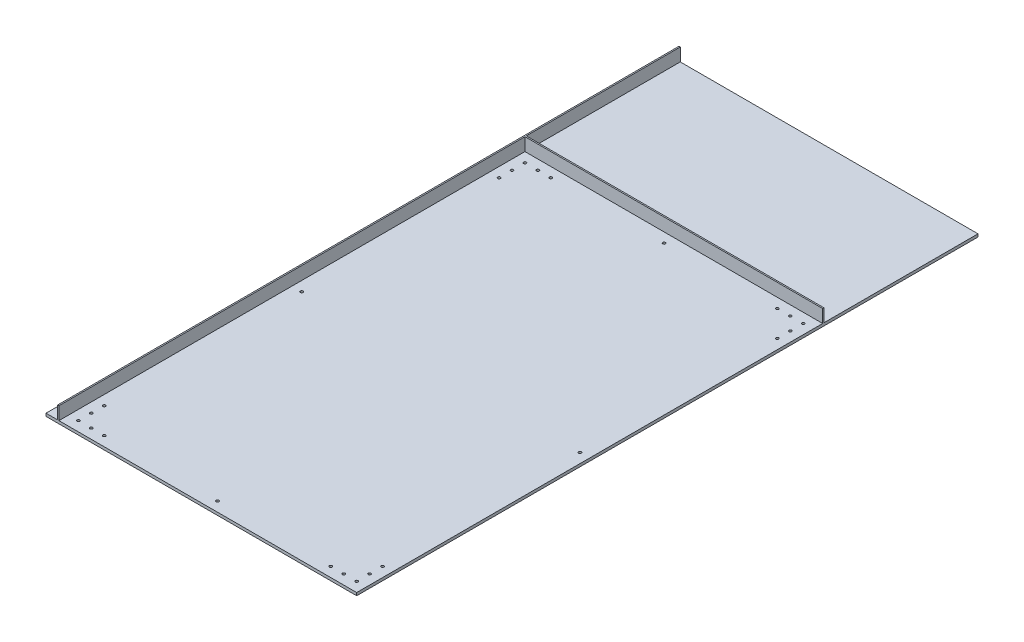
ISO-10303-21;
HEADER;
FILE_DESCRIPTION(('STEP AP214'),'2;1');
FILE_NAME('part.step','',(''),(''),'','','');
FILE_SCHEMA(('AUTOMOTIVE_DESIGN { 1 0 10303 214 1 1 1 1 }'));
ENDSEC;
DATA;
#1=APPLICATION_CONTEXT('core data for automotive mechanical design processes');
#2=APPLICATION_PROTOCOL_DEFINITION('international standard','automotive_design',2000,#1);
#3=PRODUCT_CONTEXT('',#1,'mechanical');
#4=PRODUCT('Part','Part','',(#3));
#5=PRODUCT_RELATED_PRODUCT_CATEGORY('part','',(#4));
#6=PRODUCT_DEFINITION_FORMATION('','',#4);
#7=PRODUCT_DEFINITION_CONTEXT('part definition',#1,'design');
#8=PRODUCT_DEFINITION('design','',#6,#7);
#9=PRODUCT_DEFINITION_SHAPE('','',#8);
#10=(LENGTH_UNIT() NAMED_UNIT(*) SI_UNIT(.MILLI.,.METRE.));
#11=(NAMED_UNIT(*) PLANE_ANGLE_UNIT() SI_UNIT($,.RADIAN.));
#12=(NAMED_UNIT(*) SI_UNIT($,.STERADIAN.) SOLID_ANGLE_UNIT());
#13=UNCERTAINTY_MEASURE_WITH_UNIT(LENGTH_MEASURE(1.E-05),#10,'distance_accuracy_value','');
#14=(GEOMETRIC_REPRESENTATION_CONTEXT(3) GLOBAL_UNCERTAINTY_ASSIGNED_CONTEXT((#13)) GLOBAL_UNIT_ASSIGNED_CONTEXT((#10,
#11,#12)) REPRESENTATION_CONTEXT('',''));
#15=CARTESIAN_POINT('',(0.,0.,0.));
#16=DIRECTION('',(0.,0.,1.));
#17=DIRECTION('',(1.,0.,0.));
#18=AXIS2_PLACEMENT_3D('',#15,#16,#17);
#19=CARTESIAN_POINT('',(0.,5.5,0.));
#20=DIRECTION('',(0.,1.,0.));
#21=DIRECTION('',(0.,0.,1.));
#22=AXIS2_PLACEMENT_3D('',#19,#20,#21);
#23=PLANE('',#22);
#24=DIRECTION('',(1.,0.,0.));
#25=VECTOR('',#24,1.);
#26=CARTESIAN_POINT('',(-304.8,5.5,609.6));
#27=LINE('',#26,#25);
#28=CARTESIAN_POINT('',(-304.8,5.5,609.6));
#29=VERTEX_POINT('',#28);
#30=CARTESIAN_POINT('',(-281.94,5.5,609.6));
#31=VERTEX_POINT('',#30);
#32=EDGE_CURVE('E99',#29,#31,#27,.T.);
#33=ORIENTED_EDGE('',*,*,#32,.T.);
#34=DIRECTION('',(0.,0.,1.));
#35=VECTOR('',#34,1.);
#36=CARTESIAN_POINT('',(-281.94,5.5,-609.6));
#37=LINE('',#36,#35);
#38=CARTESIAN_POINT('',(-281.94,5.5,-609.6));
#39=VERTEX_POINT('',#38);
#40=EDGE_CURVE('E184',#39,#31,#37,.T.);
#41=ORIENTED_EDGE('',*,*,#40,.F.);
#42=DIRECTION('',(-1.,0.,0.));
#43=VECTOR('',#42,1.);
#44=CARTESIAN_POINT('',(-304.8,5.5,-609.6));
#45=LINE('',#44,#43);
#46=CARTESIAN_POINT('',(-304.8,5.5,-609.6));
#47=VERTEX_POINT('',#46);
#48=EDGE_CURVE('E256',#39,#47,#45,.T.);
#49=ORIENTED_EDGE('',*,*,#48,.T.);
#50=DIRECTION('',(0.,0.,1.));
#51=VECTOR('',#50,1.);
#52=CARTESIAN_POINT('',(-304.8,5.5,-609.6));
#53=LINE('',#52,#51);
#54=EDGE_CURVE('E261',#47,#29,#53,.T.);
#55=ORIENTED_EDGE('',*,*,#54,.T.);
#56=EDGE_LOOP('',(#33,#41,#49,#55));
#57=FACE_BOUND('',#56,.T.);
#58=ADVANCED_FACE('F75',(#57),#23,.T.);
#59=DIRECTION('',(0.,0.,1.));
#60=VECTOR('',#59,1.);
#61=CARTESIAN_POINT('',(-279.4,5.5,-609.6));
#62=LINE('',#61,#60);
#63=CARTESIAN_POINT('',(-279.4,5.5,-609.6));
#64=VERTEX_POINT('',#63);
#65=CARTESIAN_POINT('',(-279.4,5.5,-307.34));
#66=VERTEX_POINT('',#65);
#67=EDGE_CURVE('E179',#64,#66,#62,.T.);
#68=ORIENTED_EDGE('',*,*,#67,.T.);
#69=DIRECTION('',(1.,0.,0.));
#70=VECTOR('',#69,1.);
#71=CARTESIAN_POINT('',(-279.4,5.5,-307.34));
#72=LINE('',#71,#70);
#73=CARTESIAN_POINT('',(304.8,5.5,-307.34));
#74=VERTEX_POINT('',#73);
#75=EDGE_CURVE('E224',#66,#74,#72,.T.);
#76=ORIENTED_EDGE('',*,*,#75,.T.);
#77=DIRECTION('',(0.,0.,-1.));
#78=VECTOR('',#77,1.);
#79=CARTESIAN_POINT('',(304.8,5.5,-609.6));
#80=LINE('',#79,#78);
#81=CARTESIAN_POINT('',(304.8,5.5,-609.6));
#82=VERTEX_POINT('',#81);
#83=EDGE_CURVE('E257',#74,#82,#80,.T.);
#84=ORIENTED_EDGE('',*,*,#83,.T.);
#85=EDGE_CURVE('E258',#82,#64,#45,.T.);
#86=ORIENTED_EDGE('',*,*,#85,.T.);
#87=EDGE_LOOP('',(#68,#76,#84,#86));
#88=FACE_BOUND('',#87,.T.);
#89=ADVANCED_FACE('F312',(#88),#23,.T.);
#90=CARTESIAN_POINT('',(304.8,5.5,-609.6));
#91=DIRECTION('',(-1.,0.,0.));
#92=DIRECTION('',(0.,0.,1.));
#93=AXIS2_PLACEMENT_3D('',#90,#91,#92);
#94=PLANE('',#93);
#95=ORIENTED_EDGE('',*,*,#83,.F.);
#96=DIRECTION('',(0.,-1.,0.));
#97=VECTOR('',#96,1.);
#98=CARTESIAN_POINT('',(304.8,30.9,-307.34));
#99=LINE('',#98,#97);
#100=CARTESIAN_POINT('',(304.8,30.9,-307.34));
#101=VERTEX_POINT('',#100);
#102=EDGE_CURVE('E245',#101,#74,#99,.T.);
#103=ORIENTED_EDGE('',*,*,#102,.F.);
#104=DIRECTION('',(0.,0.,1.));
#105=VECTOR('',#104,1.);
#106=CARTESIAN_POINT('',(304.8,30.9,-307.34));
#107=LINE('',#106,#105);
#108=CARTESIAN_POINT('',(304.8,30.9,-304.8));
#109=VERTEX_POINT('',#108);
#110=EDGE_CURVE('E223',#101,#109,#107,.T.);
#111=ORIENTED_EDGE('',*,*,#110,.T.);
#112=DIRECTION('',(0.,-1.,0.));
#113=VECTOR('',#112,1.);
#114=CARTESIAN_POINT('',(304.8,30.9,-304.8));
#115=LINE('',#114,#113);
#116=CARTESIAN_POINT('',(304.8,5.5,-304.8));
#117=VERTEX_POINT('',#116);
#118=EDGE_CURVE('E248',#109,#117,#115,.T.);
#119=ORIENTED_EDGE('',*,*,#118,.T.);
#120=CARTESIAN_POINT('',(304.8,5.5,609.6));
#121=VERTEX_POINT('',#120);
#122=EDGE_CURVE('E252',#121,#117,#80,.T.);
#123=ORIENTED_EDGE('',*,*,#122,.F.);
#124=DIRECTION('',(0.,-1.,0.));
#125=VECTOR('',#124,1.);
#126=CARTESIAN_POINT('',(304.8,5.5,609.6));
#127=LINE('',#126,#125);
#128=CARTESIAN_POINT('',(304.8,0.,609.6));
#129=VERTEX_POINT('',#128);
#130=EDGE_CURVE('E267',#121,#129,#127,.T.);
#131=ORIENTED_EDGE('',*,*,#130,.T.);
#132=DIRECTION('',(0.,0.,-1.));
#133=VECTOR('',#132,1.);
#134=CARTESIAN_POINT('',(304.8,0.,-609.6));
#135=LINE('',#134,#133);
#136=CARTESIAN_POINT('',(304.8,0.,-609.6));
#137=VERTEX_POINT('',#136);
#138=EDGE_CURVE('E251',#129,#137,#135,.T.);
#139=ORIENTED_EDGE('',*,*,#138,.T.);
#140=DIRECTION('',(0.,-1.,0.));
#141=VECTOR('',#140,1.);
#142=CARTESIAN_POINT('',(304.8,5.5,-609.6));
#143=LINE('',#142,#141);
#144=EDGE_CURVE('E12',#82,#137,#143,.T.);
#145=ORIENTED_EDGE('',*,*,#144,.F.);
#146=EDGE_LOOP('',(#95,#103,#111,#119,#123,#131,#139,#145));
#147=FACE_BOUND('',#146,.T.);
#148=ADVANCED_FACE('F77',(#147),#94,.F.);
#149=CARTESIAN_POINT('',(-304.8,5.5,-609.6));
#150=DIRECTION('',(0.,0.,1.));
#151=DIRECTION('',(1.,0.,0.));
#152=AXIS2_PLACEMENT_3D('',#149,#150,#151);
#153=PLANE('',#152);
#154=DIRECTION('',(-1.,0.,0.));
#155=VECTOR('',#154,1.);
#156=CARTESIAN_POINT('',(-304.8,0.,-609.6));
#157=LINE('',#156,#155);
#158=CARTESIAN_POINT('',(-304.8,0.,-609.6));
#159=VERTEX_POINT('',#158);
#160=EDGE_CURVE('E271',#137,#159,#157,.T.);
#161=ORIENTED_EDGE('',*,*,#160,.T.);
#162=DIRECTION('',(0.,-1.,0.));
#163=VECTOR('',#162,1.);
#164=CARTESIAN_POINT('',(-304.8,5.5,-609.6));
#165=LINE('',#164,#163);
#166=EDGE_CURVE('E84',#47,#159,#165,.T.);
#167=ORIENTED_EDGE('',*,*,#166,.F.);
#168=ORIENTED_EDGE('',*,*,#48,.F.);
#169=DIRECTION('',(0.,-1.,0.));
#170=VECTOR('',#169,1.);
#171=CARTESIAN_POINT('',(-281.94,30.9,-609.6));
#172=LINE('',#171,#170);
#173=CARTESIAN_POINT('',(-281.94,30.9,-609.6));
#174=VERTEX_POINT('',#173);
#175=EDGE_CURVE('E205',#174,#39,#172,.T.);
#176=ORIENTED_EDGE('',*,*,#175,.F.);
#177=DIRECTION('',(1.,0.,0.));
#178=VECTOR('',#177,1.);
#179=CARTESIAN_POINT('',(-281.94,30.9,-609.6));
#180=LINE('',#179,#178);
#181=CARTESIAN_POINT('',(-279.4,30.9,-609.6));
#182=VERTEX_POINT('',#181);
#183=EDGE_CURVE('E175',#174,#182,#180,.T.);
#184=ORIENTED_EDGE('',*,*,#183,.T.);
#185=DIRECTION('',(0.,-1.,0.));
#186=VECTOR('',#185,1.);
#187=CARTESIAN_POINT('',(-279.4,30.9,-609.6));
#188=LINE('',#187,#186);
#189=EDGE_CURVE('E214',#182,#64,#188,.T.);
#190=ORIENTED_EDGE('',*,*,#189,.T.);
#191=ORIENTED_EDGE('',*,*,#85,.F.);
#192=ORIENTED_EDGE('',*,*,#144,.T.);
#193=EDGE_LOOP('',(#161,#167,#168,#176,#184,#190,#191,#192));
#194=FACE_BOUND('',#193,.T.);
#195=ADVANCED_FACE('F313',(#194),#153,.F.);
#196=CARTESIAN_POINT('',(-304.8,5.5,-609.6));
#197=DIRECTION('',(1.,0.,0.));
#198=DIRECTION('',(0.,0.,-1.));
#199=AXIS2_PLACEMENT_3D('',#196,#197,#198);
#200=PLANE('',#199);
#201=DIRECTION('',(0.,0.,1.));
#202=VECTOR('',#201,1.);
#203=CARTESIAN_POINT('',(-304.8,0.,-609.6));
#204=LINE('',#203,#202);
#205=CARTESIAN_POINT('',(-304.8,0.,609.6));
#206=VERTEX_POINT('',#205);
#207=EDGE_CURVE('E274',#159,#206,#204,.T.);
#208=ORIENTED_EDGE('',*,*,#207,.T.);
#209=DIRECTION('',(0.,-1.,0.));
#210=VECTOR('',#209,1.);
#211=CARTESIAN_POINT('',(-304.8,5.5,609.6));
#212=LINE('',#211,#210);
#213=EDGE_CURVE('E283',#29,#206,#212,.T.);
#214=ORIENTED_EDGE('',*,*,#213,.F.);
#215=ORIENTED_EDGE('',*,*,#54,.F.);
#216=ORIENTED_EDGE('',*,*,#166,.T.);
#217=EDGE_LOOP('',(#208,#214,#215,#216));
#218=FACE_BOUND('',#217,.T.);
#219=ADVANCED_FACE('F292',(#218),#200,.F.);
#220=CARTESIAN_POINT('',(-304.8,5.5,609.6));
#221=DIRECTION('',(0.,0.,-1.));
#222=DIRECTION('',(-1.,0.,0.));
#223=AXIS2_PLACEMENT_3D('',#220,#221,#222);
#224=PLANE('',#223);
#225=DIRECTION('',(1.,0.,0.));
#226=VECTOR('',#225,1.);
#227=CARTESIAN_POINT('',(-304.8,0.,609.6));
#228=LINE('',#227,#226);
#229=EDGE_CURVE('E277',#206,#129,#228,.T.);
#230=ORIENTED_EDGE('',*,*,#229,.T.);
#231=ORIENTED_EDGE('',*,*,#130,.F.);
#232=CARTESIAN_POINT('',(-279.4,5.5,609.6));
#233=VERTEX_POINT('',#232);
#234=EDGE_CURVE('E264',#233,#121,#27,.T.);
#235=ORIENTED_EDGE('',*,*,#234,.F.);
#236=DIRECTION('',(0.,-1.,0.));
#237=VECTOR('',#236,1.);
#238=CARTESIAN_POINT('',(-279.4,30.9,609.6));
#239=LINE('',#238,#237);
#240=CARTESIAN_POINT('',(-279.4,30.9,609.6));
#241=VERTEX_POINT('',#240);
#242=EDGE_CURVE('E188',#241,#233,#239,.T.);
#243=ORIENTED_EDGE('',*,*,#242,.F.);
#244=DIRECTION('',(-1.,0.,0.));
#245=VECTOR('',#244,1.);
#246=CARTESIAN_POINT('',(-279.4,30.9,609.6));
#247=LINE('',#246,#245);
#248=CARTESIAN_POINT('',(-281.94,30.9,609.6));
#249=VERTEX_POINT('',#248);
#250=EDGE_CURVE('E172',#241,#249,#247,.T.);
#251=ORIENTED_EDGE('',*,*,#250,.T.);
#252=DIRECTION('',(0.,-1.,0.));
#253=VECTOR('',#252,1.);
#254=CARTESIAN_POINT('',(-281.94,30.9,609.6));
#255=LINE('',#254,#253);
#256=EDGE_CURVE('E182',#249,#31,#255,.T.);
#257=ORIENTED_EDGE('',*,*,#256,.T.);
#258=ORIENTED_EDGE('',*,*,#32,.F.);
#259=ORIENTED_EDGE('',*,*,#213,.T.);
#260=EDGE_LOOP('',(#230,#231,#235,#243,#251,#257,#258,#259));
#261=FACE_BOUND('',#260,.T.);
#262=ADVANCED_FACE('F191',(#261),#224,.F.);
#263=CARTESIAN_POINT('',(-260.35,5.5,-285.75));
#264=DIRECTION('',(0.,1.,0.));
#265=DIRECTION('',(0.,0.,1.));
#266=AXIS2_PLACEMENT_3D('',#263,#264,#265);
#267=CIRCLE('',#266,2.64999999999999);
#268=CARTESIAN_POINT('',(-260.35,5.5,-283.1));
#269=VERTEX_POINT('',#268);
#270=EDGE_CURVE('E513',#269,#269,#267,.T.);
#271=ORIENTED_EDGE('',*,*,#270,.F.);
#272=EDGE_LOOP('',(#271));
#273=FACE_BOUND('',#272,.T.);
#274=CARTESIAN_POINT('',(-234.95,5.5,-285.75));
#275=DIRECTION('',(0.,1.,0.));
#276=DIRECTION('',(0.,0.,1.));
#277=AXIS2_PLACEMENT_3D('',#274,#275,#276);
#278=CIRCLE('',#277,2.65000000000001);
#279=CARTESIAN_POINT('',(-234.95,5.5,-283.1));
#280=VERTEX_POINT('',#279);
#281=EDGE_CURVE('E505',#280,#280,#278,.T.);
#282=ORIENTED_EDGE('',*,*,#281,.F.);
#283=EDGE_LOOP('',(#282));
#284=FACE_BOUND('',#283,.T.);
#285=CARTESIAN_POINT('',(-209.55,5.5,-285.75));
#286=DIRECTION('',(0.,1.,0.));
#287=DIRECTION('',(0.,0.,1.));
#288=AXIS2_PLACEMENT_3D('',#285,#286,#287);
#289=CIRCLE('',#288,2.64999999999999);
#290=CARTESIAN_POINT('',(-209.55,5.5,-283.1));
#291=VERTEX_POINT('',#290);
#292=EDGE_CURVE('E497',#291,#291,#289,.T.);
#293=ORIENTED_EDGE('',*,*,#292,.F.);
#294=EDGE_LOOP('',(#293));
#295=FACE_BOUND('',#294,.T.);
#296=CARTESIAN_POINT('',(-260.35,5.5,-260.35));
#297=DIRECTION('',(0.,1.,0.));
#298=DIRECTION('',(0.,0.,1.));
#299=AXIS2_PLACEMENT_3D('',#296,#297,#298);
#300=CIRCLE('',#299,2.64999999999999);
#301=CARTESIAN_POINT('',(-260.35,5.5,-257.7));
#302=VERTEX_POINT('',#301);
#303=EDGE_CURVE('E489',#302,#302,#300,.T.);
#304=ORIENTED_EDGE('',*,*,#303,.F.);
#305=EDGE_LOOP('',(#304));
#306=FACE_BOUND('',#305,.T.);
#307=CARTESIAN_POINT('',(-260.35,5.5,-234.95));
#308=DIRECTION('',(0.,1.,0.));
#309=DIRECTION('',(0.,0.,1.));
#310=AXIS2_PLACEMENT_3D('',#307,#308,#309);
#311=CIRCLE('',#310,2.64999999999999);
#312=CARTESIAN_POINT('',(-260.35,5.5,-232.3));
#313=VERTEX_POINT('',#312);
#314=EDGE_CURVE('E481',#313,#313,#311,.T.);
#315=ORIENTED_EDGE('',*,*,#314,.F.);
#316=EDGE_LOOP('',(#315));
#317=FACE_BOUND('',#316,.T.);
#318=CARTESIAN_POINT('',(12.7000000000002,5.5,-285.75));
#319=DIRECTION('',(0.,1.,0.));
#320=DIRECTION('',(0.,0.,1.));
#321=AXIS2_PLACEMENT_3D('',#318,#319,#320);
#322=CIRCLE('',#321,2.65);
#323=CARTESIAN_POINT('',(12.7000000000002,5.5,-283.1));
#324=VERTEX_POINT('',#323);
#325=EDGE_CURVE('E473',#324,#324,#322,.T.);
#326=ORIENTED_EDGE('',*,*,#325,.F.);
#327=EDGE_LOOP('',(#326));
#328=FACE_BOUND('',#327,.T.);
#329=CARTESIAN_POINT('',(234.95,5.5,-285.75));
#330=DIRECTION('',(0.,1.,0.));
#331=DIRECTION('',(0.,0.,1.));
#332=AXIS2_PLACEMENT_3D('',#329,#330,#331);
#333=CIRCLE('',#332,2.64999999999999);
#334=CARTESIAN_POINT('',(234.95,5.5,-283.1));
#335=VERTEX_POINT('',#334);
#336=EDGE_CURVE('E465',#335,#335,#333,.T.);
#337=ORIENTED_EDGE('',*,*,#336,.F.);
#338=EDGE_LOOP('',(#337));
#339=FACE_BOUND('',#338,.T.);
#340=CARTESIAN_POINT('',(260.35,5.5,-285.75));
#341=DIRECTION('',(0.,1.,0.));
#342=DIRECTION('',(0.,0.,1.));
#343=AXIS2_PLACEMENT_3D('',#340,#341,#342);
#344=CIRCLE('',#343,2.64999999999999);
#345=CARTESIAN_POINT('',(260.35,5.5,-283.1));
#346=VERTEX_POINT('',#345);
#347=EDGE_CURVE('E457',#346,#346,#344,.T.);
#348=ORIENTED_EDGE('',*,*,#347,.F.);
#349=EDGE_LOOP('',(#348));
#350=FACE_BOUND('',#349,.T.);
#351=CARTESIAN_POINT('',(285.75,5.5,-285.75));
#352=DIRECTION('',(0.,1.,0.));
#353=DIRECTION('',(0.,0.,1.));
#354=AXIS2_PLACEMENT_3D('',#351,#352,#353);
#355=CIRCLE('',#354,2.64999999999999);
#356=CARTESIAN_POINT('',(285.75,5.5,-283.1));
#357=VERTEX_POINT('',#356);
#358=EDGE_CURVE('E449',#357,#357,#355,.T.);
#359=ORIENTED_EDGE('',*,*,#358,.F.);
#360=EDGE_LOOP('',(#359));
#361=FACE_BOUND('',#360,.T.);
#362=CARTESIAN_POINT('',(285.75,5.5,-260.35));
#363=DIRECTION('',(0.,1.,0.));
#364=DIRECTION('',(0.,0.,1.));
#365=AXIS2_PLACEMENT_3D('',#362,#363,#364);
#366=CIRCLE('',#365,2.64999999999999);
#367=CARTESIAN_POINT('',(285.75,5.5,-257.7));
#368=VERTEX_POINT('',#367);
#369=EDGE_CURVE('E441',#368,#368,#366,.T.);
#370=ORIENTED_EDGE('',*,*,#369,.F.);
#371=EDGE_LOOP('',(#370));
#372=FACE_BOUND('',#371,.T.);
#373=CARTESIAN_POINT('',(285.75,5.5,-234.95));
#374=DIRECTION('',(0.,1.,0.));
#375=DIRECTION('',(0.,0.,1.));
#376=AXIS2_PLACEMENT_3D('',#373,#374,#375);
#377=CIRCLE('',#376,2.64999999999999);
#378=CARTESIAN_POINT('',(285.75,5.5,-232.3));
#379=VERTEX_POINT('',#378);
#380=EDGE_CURVE('E433',#379,#379,#377,.T.);
#381=ORIENTED_EDGE('',*,*,#380,.F.);
#382=EDGE_LOOP('',(#381));
#383=FACE_BOUND('',#382,.T.);
#384=CARTESIAN_POINT('',(-260.35,5.5,152.4));
#385=DIRECTION('',(0.,1.,0.));
#386=DIRECTION('',(0.,0.,1.));
#387=AXIS2_PLACEMENT_3D('',#384,#385,#386);
#388=CIRCLE('',#387,2.64999999999999);
#389=CARTESIAN_POINT('',(-260.35,5.5,155.05));
#390=VERTEX_POINT('',#389);
#391=EDGE_CURVE('E425',#390,#390,#388,.T.);
#392=ORIENTED_EDGE('',*,*,#391,.F.);
#393=EDGE_LOOP('',(#392));
#394=FACE_BOUND('',#393,.T.);
#395=CARTESIAN_POINT('',(285.75,5.5,152.4));
#396=DIRECTION('',(0.,1.,0.));
#397=DIRECTION('',(0.,0.,1.));
#398=AXIS2_PLACEMENT_3D('',#395,#396,#397);
#399=CIRCLE('',#398,2.64999999999999);
#400=CARTESIAN_POINT('',(285.75,5.5,155.05));
#401=VERTEX_POINT('',#400);
#402=EDGE_CURVE('E417',#401,#401,#399,.T.);
#403=ORIENTED_EDGE('',*,*,#402,.F.);
#404=EDGE_LOOP('',(#403));
#405=FACE_BOUND('',#404,.T.);
#406=CARTESIAN_POINT('',(-260.35,5.5,539.75));
#407=DIRECTION('',(0.,1.,0.));
#408=DIRECTION('',(0.,0.,1.));
#409=AXIS2_PLACEMENT_3D('',#406,#407,#408);
#410=CIRCLE('',#409,2.64999999999999);
#411=CARTESIAN_POINT('',(-260.35,5.5,542.4));
#412=VERTEX_POINT('',#411);
#413=EDGE_CURVE('E409',#412,#412,#410,.T.);
#414=ORIENTED_EDGE('',*,*,#413,.F.);
#415=EDGE_LOOP('',(#414));
#416=FACE_BOUND('',#415,.T.);
#417=CARTESIAN_POINT('',(-260.35,5.5,565.15));
#418=DIRECTION('',(0.,1.,0.));
#419=DIRECTION('',(0.,0.,1.));
#420=AXIS2_PLACEMENT_3D('',#417,#418,#419);
#421=CIRCLE('',#420,2.64999999999999);
#422=CARTESIAN_POINT('',(-260.35,5.5,567.8));
#423=VERTEX_POINT('',#422);
#424=EDGE_CURVE('E401',#423,#423,#421,.T.);
#425=ORIENTED_EDGE('',*,*,#424,.F.);
#426=EDGE_LOOP('',(#425));
#427=FACE_BOUND('',#426,.T.);
#428=CARTESIAN_POINT('',(-260.35,5.5,590.55));
#429=DIRECTION('',(0.,1.,0.));
#430=DIRECTION('',(0.,0.,1.));
#431=AXIS2_PLACEMENT_3D('',#428,#429,#430);
#432=CIRCLE('',#431,2.64999999999999);
#433=CARTESIAN_POINT('',(-260.35,5.5,593.2));
#434=VERTEX_POINT('',#433);
#435=EDGE_CURVE('E393',#434,#434,#432,.T.);
#436=ORIENTED_EDGE('',*,*,#435,.F.);
#437=EDGE_LOOP('',(#436));
#438=FACE_BOUND('',#437,.T.);
#439=CARTESIAN_POINT('',(-234.95,5.5,590.55));
#440=DIRECTION('',(0.,1.,0.));
#441=DIRECTION('',(0.,0.,1.));
#442=AXIS2_PLACEMENT_3D('',#439,#440,#441);
#443=CIRCLE('',#442,2.65000000000001);
#444=CARTESIAN_POINT('',(-234.95,5.5,593.2));
#445=VERTEX_POINT('',#444);
#446=EDGE_CURVE('E385',#445,#445,#443,.T.);
#447=ORIENTED_EDGE('',*,*,#446,.F.);
#448=EDGE_LOOP('',(#447));
#449=FACE_BOUND('',#448,.T.);
#450=CARTESIAN_POINT('',(-209.55,5.5,590.55));
#451=DIRECTION('',(0.,1.,0.));
#452=DIRECTION('',(0.,0.,1.));
#453=AXIS2_PLACEMENT_3D('',#450,#451,#452);
#454=CIRCLE('',#453,2.64999999999999);
#455=CARTESIAN_POINT('',(-209.55,5.5,593.2));
#456=VERTEX_POINT('',#455);
#457=EDGE_CURVE('E377',#456,#456,#454,.T.);
#458=ORIENTED_EDGE('',*,*,#457,.F.);
#459=EDGE_LOOP('',(#458));
#460=FACE_BOUND('',#459,.T.);
#461=CARTESIAN_POINT('',(12.7000000000002,5.5,590.55));
#462=DIRECTION('',(0.,1.,0.));
#463=DIRECTION('',(0.,0.,1.));
#464=AXIS2_PLACEMENT_3D('',#461,#462,#463);
#465=CIRCLE('',#464,2.65);
#466=CARTESIAN_POINT('',(12.7000000000002,5.5,593.2));
#467=VERTEX_POINT('',#466);
#468=EDGE_CURVE('E369',#467,#467,#465,.T.);
#469=ORIENTED_EDGE('',*,*,#468,.F.);
#470=EDGE_LOOP('',(#469));
#471=FACE_BOUND('',#470,.T.);
#472=CARTESIAN_POINT('',(234.95,5.5,590.55));
#473=DIRECTION('',(0.,1.,0.));
#474=DIRECTION('',(0.,0.,1.));
#475=AXIS2_PLACEMENT_3D('',#472,#473,#474);
#476=CIRCLE('',#475,2.64999999999999);
#477=CARTESIAN_POINT('',(234.95,5.5,593.2));
#478=VERTEX_POINT('',#477);
#479=EDGE_CURVE('E361',#478,#478,#476,.T.);
#480=ORIENTED_EDGE('',*,*,#479,.F.);
#481=EDGE_LOOP('',(#480));
#482=FACE_BOUND('',#481,.T.);
#483=CARTESIAN_POINT('',(260.35,5.5,590.55));
#484=DIRECTION('',(0.,1.,0.));
#485=DIRECTION('',(0.,0.,1.));
#486=AXIS2_PLACEMENT_3D('',#483,#484,#485);
#487=CIRCLE('',#486,2.64999999999999);
#488=CARTESIAN_POINT('',(260.35,5.5,593.2));
#489=VERTEX_POINT('',#488);
#490=EDGE_CURVE('E353',#489,#489,#487,.T.);
#491=ORIENTED_EDGE('',*,*,#490,.F.);
#492=EDGE_LOOP('',(#491));
#493=FACE_BOUND('',#492,.T.);
#494=CARTESIAN_POINT('',(285.75,5.5,590.55));
#495=DIRECTION('',(0.,1.,0.));
#496=DIRECTION('',(0.,0.,1.));
#497=AXIS2_PLACEMENT_3D('',#494,#495,#496);
#498=CIRCLE('',#497,2.64999999999999);
#499=CARTESIAN_POINT('',(285.75,5.5,593.2));
#500=VERTEX_POINT('',#499);
#501=EDGE_CURVE('E345',#500,#500,#498,.T.);
#502=ORIENTED_EDGE('',*,*,#501,.F.);
#503=EDGE_LOOP('',(#502));
#504=FACE_BOUND('',#503,.T.);
#505=CARTESIAN_POINT('',(285.75,5.5,565.15));
#506=DIRECTION('',(0.,1.,0.));
#507=DIRECTION('',(0.,0.,1.));
#508=AXIS2_PLACEMENT_3D('',#505,#506,#507);
#509=CIRCLE('',#508,2.64999999999999);
#510=CARTESIAN_POINT('',(285.75,5.5,567.8));
#511=VERTEX_POINT('',#510);
#512=EDGE_CURVE('E337',#511,#511,#509,.T.);
#513=ORIENTED_EDGE('',*,*,#512,.F.);
#514=EDGE_LOOP('',(#513));
#515=FACE_BOUND('',#514,.T.);
#516=CARTESIAN_POINT('',(285.75,5.5,539.75));
#517=DIRECTION('',(0.,1.,0.));
#518=DIRECTION('',(0.,0.,1.));
#519=AXIS2_PLACEMENT_3D('',#516,#517,#518);
#520=CIRCLE('',#519,2.64999999999999);
#521=CARTESIAN_POINT('',(285.75,5.5,542.4));
#522=VERTEX_POINT('',#521);
#523=EDGE_CURVE('E330',#522,#522,#520,.T.);
#524=ORIENTED_EDGE('',*,*,#523,.F.);
#525=EDGE_LOOP('',(#524));
#526=FACE_BOUND('',#525,.T.);
#527=CARTESIAN_POINT('',(-279.4,5.5,-304.8));
#528=VERTEX_POINT('',#527);
#529=EDGE_CURVE('E91',#528,#233,#62,.T.);
#530=ORIENTED_EDGE('',*,*,#529,.T.);
#531=ORIENTED_EDGE('',*,*,#234,.T.);
#532=ORIENTED_EDGE('',*,*,#122,.T.);
#533=DIRECTION('',(1.,0.,0.));
#534=VECTOR('',#533,1.);
#535=CARTESIAN_POINT('',(-279.4,5.5,-304.8));
#536=LINE('',#535,#534);
#537=EDGE_CURVE('E187',#528,#117,#536,.T.);
#538=ORIENTED_EDGE('',*,*,#537,.F.);
#539=EDGE_LOOP('',(#530,#531,#532,#538));
#540=FACE_BOUND('',#539,.T.);
#541=ADVANCED_FACE('F306',(#273,#284,#295,#306,#317,#328,#339,#350,#361,#372,#383,#394,#405,
#416,#427,#438,#449,#460,#471,#482,#493,#504,#515,#526,#540),#23,.T.);
#542=CARTESIAN_POINT('',(0.,0.,0.));
#543=DIRECTION('',(0.,1.,0.));
#544=DIRECTION('',(0.,0.,1.));
#545=AXIS2_PLACEMENT_3D('',#542,#543,#544);
#546=PLANE('',#545);
#547=CARTESIAN_POINT('',(-260.35,0.,-285.75));
#548=DIRECTION('',(0.,1.,0.));
#549=DIRECTION('',(0.,0.,1.));
#550=AXIS2_PLACEMENT_3D('',#547,#548,#549);
#551=CIRCLE('',#550,2.64999999999999);
#552=CARTESIAN_POINT('',(-260.35,0.,-283.1));
#553=VERTEX_POINT('',#552);
#554=EDGE_CURVE('E509',#553,#553,#551,.T.);
#555=ORIENTED_EDGE('',*,*,#554,.T.);
#556=EDGE_LOOP('',(#555));
#557=FACE_BOUND('',#556,.T.);
#558=CARTESIAN_POINT('',(-234.95,0.,-285.75));
#559=DIRECTION('',(0.,1.,0.));
#560=DIRECTION('',(0.,0.,1.));
#561=AXIS2_PLACEMENT_3D('',#558,#559,#560);
#562=CIRCLE('',#561,2.64999999999999);
#563=CARTESIAN_POINT('',(-234.95,0.,-283.1));
#564=VERTEX_POINT('',#563);
#565=EDGE_CURVE('E501',#564,#564,#562,.T.);
#566=ORIENTED_EDGE('',*,*,#565,.T.);
#567=EDGE_LOOP('',(#566));
#568=FACE_BOUND('',#567,.T.);
#569=CARTESIAN_POINT('',(-209.55,0.,-285.75));
#570=DIRECTION('',(0.,1.,0.));
#571=DIRECTION('',(0.,0.,1.));
#572=AXIS2_PLACEMENT_3D('',#569,#570,#571);
#573=CIRCLE('',#572,2.64999999999999);
#574=CARTESIAN_POINT('',(-209.55,0.,-283.1));
#575=VERTEX_POINT('',#574);
#576=EDGE_CURVE('E493',#575,#575,#573,.T.);
#577=ORIENTED_EDGE('',*,*,#576,.T.);
#578=EDGE_LOOP('',(#577));
#579=FACE_BOUND('',#578,.T.);
#580=CARTESIAN_POINT('',(-260.35,0.,-260.35));
#581=DIRECTION('',(0.,1.,0.));
#582=DIRECTION('',(0.,0.,1.));
#583=AXIS2_PLACEMENT_3D('',#580,#581,#582);
#584=CIRCLE('',#583,2.64999999999999);
#585=CARTESIAN_POINT('',(-260.35,0.,-257.7));
#586=VERTEX_POINT('',#585);
#587=EDGE_CURVE('E485',#586,#586,#584,.T.);
#588=ORIENTED_EDGE('',*,*,#587,.T.);
#589=EDGE_LOOP('',(#588));
#590=FACE_BOUND('',#589,.T.);
#591=CARTESIAN_POINT('',(-260.35,0.,-234.95));
#592=DIRECTION('',(0.,1.,0.));
#593=DIRECTION('',(0.,0.,1.));
#594=AXIS2_PLACEMENT_3D('',#591,#592,#593);
#595=CIRCLE('',#594,2.64999999999999);
#596=CARTESIAN_POINT('',(-260.35,0.,-232.3));
#597=VERTEX_POINT('',#596);
#598=EDGE_CURVE('E477',#597,#597,#595,.T.);
#599=ORIENTED_EDGE('',*,*,#598,.T.);
#600=EDGE_LOOP('',(#599));
#601=FACE_BOUND('',#600,.T.);
#602=CARTESIAN_POINT('',(12.7000000000002,0.,-285.75));
#603=DIRECTION('',(0.,1.,0.));
#604=DIRECTION('',(0.,0.,1.));
#605=AXIS2_PLACEMENT_3D('',#602,#603,#604);
#606=CIRCLE('',#605,2.65);
#607=CARTESIAN_POINT('',(12.7000000000002,0.,-283.1));
#608=VERTEX_POINT('',#607);
#609=EDGE_CURVE('E469',#608,#608,#606,.T.);
#610=ORIENTED_EDGE('',*,*,#609,.T.);
#611=EDGE_LOOP('',(#610));
#612=FACE_BOUND('',#611,.T.);
#613=CARTESIAN_POINT('',(234.95,0.,-285.75));
#614=DIRECTION('',(0.,1.,0.));
#615=DIRECTION('',(0.,0.,1.));
#616=AXIS2_PLACEMENT_3D('',#613,#614,#615);
#617=CIRCLE('',#616,2.64999999999999);
#618=CARTESIAN_POINT('',(234.95,0.,-283.1));
#619=VERTEX_POINT('',#618);
#620=EDGE_CURVE('E461',#619,#619,#617,.T.);
#621=ORIENTED_EDGE('',*,*,#620,.T.);
#622=EDGE_LOOP('',(#621));
#623=FACE_BOUND('',#622,.T.);
#624=CARTESIAN_POINT('',(260.35,0.,-285.75));
#625=DIRECTION('',(0.,1.,0.));
#626=DIRECTION('',(0.,0.,1.));
#627=AXIS2_PLACEMENT_3D('',#624,#625,#626);
#628=CIRCLE('',#627,2.64999999999999);
#629=CARTESIAN_POINT('',(260.35,0.,-283.1));
#630=VERTEX_POINT('',#629);
#631=EDGE_CURVE('E453',#630,#630,#628,.T.);
#632=ORIENTED_EDGE('',*,*,#631,.T.);
#633=EDGE_LOOP('',(#632));
#634=FACE_BOUND('',#633,.T.);
#635=CARTESIAN_POINT('',(285.75,0.,-285.75));
#636=DIRECTION('',(0.,1.,0.));
#637=DIRECTION('',(0.,0.,1.));
#638=AXIS2_PLACEMENT_3D('',#635,#636,#637);
#639=CIRCLE('',#638,2.64999999999999);
#640=CARTESIAN_POINT('',(285.75,0.,-283.1));
#641=VERTEX_POINT('',#640);
#642=EDGE_CURVE('E445',#641,#641,#639,.T.);
#643=ORIENTED_EDGE('',*,*,#642,.T.);
#644=EDGE_LOOP('',(#643));
#645=FACE_BOUND('',#644,.T.);
#646=CARTESIAN_POINT('',(285.75,0.,-260.35));
#647=DIRECTION('',(0.,1.,0.));
#648=DIRECTION('',(0.,0.,1.));
#649=AXIS2_PLACEMENT_3D('',#646,#647,#648);
#650=CIRCLE('',#649,2.64999999999999);
#651=CARTESIAN_POINT('',(285.75,0.,-257.7));
#652=VERTEX_POINT('',#651);
#653=EDGE_CURVE('E437',#652,#652,#650,.T.);
#654=ORIENTED_EDGE('',*,*,#653,.T.);
#655=EDGE_LOOP('',(#654));
#656=FACE_BOUND('',#655,.T.);
#657=CARTESIAN_POINT('',(285.75,0.,-234.95));
#658=DIRECTION('',(0.,1.,0.));
#659=DIRECTION('',(0.,0.,1.));
#660=AXIS2_PLACEMENT_3D('',#657,#658,#659);
#661=CIRCLE('',#660,2.64999999999999);
#662=CARTESIAN_POINT('',(285.75,0.,-232.3));
#663=VERTEX_POINT('',#662);
#664=EDGE_CURVE('E429',#663,#663,#661,.T.);
#665=ORIENTED_EDGE('',*,*,#664,.T.);
#666=EDGE_LOOP('',(#665));
#667=FACE_BOUND('',#666,.T.);
#668=CARTESIAN_POINT('',(-260.35,0.,152.4));
#669=DIRECTION('',(0.,1.,0.));
#670=DIRECTION('',(0.,0.,1.));
#671=AXIS2_PLACEMENT_3D('',#668,#669,#670);
#672=CIRCLE('',#671,2.64999999999999);
#673=CARTESIAN_POINT('',(-260.35,0.,155.05));
#674=VERTEX_POINT('',#673);
#675=EDGE_CURVE('E421',#674,#674,#672,.T.);
#676=ORIENTED_EDGE('',*,*,#675,.T.);
#677=EDGE_LOOP('',(#676));
#678=FACE_BOUND('',#677,.T.);
#679=CARTESIAN_POINT('',(285.75,0.,152.4));
#680=DIRECTION('',(0.,1.,0.));
#681=DIRECTION('',(0.,0.,1.));
#682=AXIS2_PLACEMENT_3D('',#679,#680,#681);
#683=CIRCLE('',#682,2.64999999999999);
#684=CARTESIAN_POINT('',(285.75,0.,155.05));
#685=VERTEX_POINT('',#684);
#686=EDGE_CURVE('E413',#685,#685,#683,.T.);
#687=ORIENTED_EDGE('',*,*,#686,.T.);
#688=EDGE_LOOP('',(#687));
#689=FACE_BOUND('',#688,.T.);
#690=CARTESIAN_POINT('',(-260.35,0.,539.75));
#691=DIRECTION('',(0.,1.,0.));
#692=DIRECTION('',(0.,0.,1.));
#693=AXIS2_PLACEMENT_3D('',#690,#691,#692);
#694=CIRCLE('',#693,2.64999999999999);
#695=CARTESIAN_POINT('',(-260.35,0.,542.4));
#696=VERTEX_POINT('',#695);
#697=EDGE_CURVE('E405',#696,#696,#694,.T.);
#698=ORIENTED_EDGE('',*,*,#697,.T.);
#699=EDGE_LOOP('',(#698));
#700=FACE_BOUND('',#699,.T.);
#701=CARTESIAN_POINT('',(-260.35,0.,565.15));
#702=DIRECTION('',(0.,1.,0.));
#703=DIRECTION('',(0.,0.,1.));
#704=AXIS2_PLACEMENT_3D('',#701,#702,#703);
#705=CIRCLE('',#704,2.64999999999999);
#706=CARTESIAN_POINT('',(-260.35,0.,567.8));
#707=VERTEX_POINT('',#706);
#708=EDGE_CURVE('E397',#707,#707,#705,.T.);
#709=ORIENTED_EDGE('',*,*,#708,.T.);
#710=EDGE_LOOP('',(#709));
#711=FACE_BOUND('',#710,.T.);
#712=CARTESIAN_POINT('',(-260.35,0.,590.55));
#713=DIRECTION('',(0.,1.,0.));
#714=DIRECTION('',(0.,0.,1.));
#715=AXIS2_PLACEMENT_3D('',#712,#713,#714);
#716=CIRCLE('',#715,2.64999999999999);
#717=CARTESIAN_POINT('',(-260.35,0.,593.2));
#718=VERTEX_POINT('',#717);
#719=EDGE_CURVE('E389',#718,#718,#716,.T.);
#720=ORIENTED_EDGE('',*,*,#719,.T.);
#721=EDGE_LOOP('',(#720));
#722=FACE_BOUND('',#721,.T.);
#723=CARTESIAN_POINT('',(-234.95,0.,590.55));
#724=DIRECTION('',(0.,1.,0.));
#725=DIRECTION('',(0.,0.,1.));
#726=AXIS2_PLACEMENT_3D('',#723,#724,#725);
#727=CIRCLE('',#726,2.64999999999999);
#728=CARTESIAN_POINT('',(-234.95,0.,593.2));
#729=VERTEX_POINT('',#728);
#730=EDGE_CURVE('E381',#729,#729,#727,.T.);
#731=ORIENTED_EDGE('',*,*,#730,.T.);
#732=EDGE_LOOP('',(#731));
#733=FACE_BOUND('',#732,.T.);
#734=CARTESIAN_POINT('',(-209.55,0.,590.55));
#735=DIRECTION('',(0.,1.,0.));
#736=DIRECTION('',(0.,0.,1.));
#737=AXIS2_PLACEMENT_3D('',#734,#735,#736);
#738=CIRCLE('',#737,2.64999999999999);
#739=CARTESIAN_POINT('',(-209.55,0.,593.2));
#740=VERTEX_POINT('',#739);
#741=EDGE_CURVE('E373',#740,#740,#738,.T.);
#742=ORIENTED_EDGE('',*,*,#741,.T.);
#743=EDGE_LOOP('',(#742));
#744=FACE_BOUND('',#743,.T.);
#745=CARTESIAN_POINT('',(12.7000000000002,0.,590.55));
#746=DIRECTION('',(0.,1.,0.));
#747=DIRECTION('',(0.,0.,1.));
#748=AXIS2_PLACEMENT_3D('',#745,#746,#747);
#749=CIRCLE('',#748,2.65);
#750=CARTESIAN_POINT('',(12.7000000000002,0.,593.2));
#751=VERTEX_POINT('',#750);
#752=EDGE_CURVE('E365',#751,#751,#749,.T.);
#753=ORIENTED_EDGE('',*,*,#752,.T.);
#754=EDGE_LOOP('',(#753));
#755=FACE_BOUND('',#754,.T.);
#756=CARTESIAN_POINT('',(234.95,0.,590.55));
#757=DIRECTION('',(0.,1.,0.));
#758=DIRECTION('',(0.,0.,1.));
#759=AXIS2_PLACEMENT_3D('',#756,#757,#758);
#760=CIRCLE('',#759,2.64999999999999);
#761=CARTESIAN_POINT('',(234.95,0.,593.2));
#762=VERTEX_POINT('',#761);
#763=EDGE_CURVE('E357',#762,#762,#760,.T.);
#764=ORIENTED_EDGE('',*,*,#763,.T.);
#765=EDGE_LOOP('',(#764));
#766=FACE_BOUND('',#765,.T.);
#767=CARTESIAN_POINT('',(260.35,0.,590.55));
#768=DIRECTION('',(0.,1.,0.));
#769=DIRECTION('',(0.,0.,1.));
#770=AXIS2_PLACEMENT_3D('',#767,#768,#769);
#771=CIRCLE('',#770,2.64999999999999);
#772=CARTESIAN_POINT('',(260.35,0.,593.2));
#773=VERTEX_POINT('',#772);
#774=EDGE_CURVE('E349',#773,#773,#771,.T.);
#775=ORIENTED_EDGE('',*,*,#774,.T.);
#776=EDGE_LOOP('',(#775));
#777=FACE_BOUND('',#776,.T.);
#778=CARTESIAN_POINT('',(285.75,0.,590.55));
#779=DIRECTION('',(0.,1.,0.));
#780=DIRECTION('',(0.,0.,1.));
#781=AXIS2_PLACEMENT_3D('',#778,#779,#780);
#782=CIRCLE('',#781,2.64999999999999);
#783=CARTESIAN_POINT('',(285.75,0.,593.2));
#784=VERTEX_POINT('',#783);
#785=EDGE_CURVE('E341',#784,#784,#782,.T.);
#786=ORIENTED_EDGE('',*,*,#785,.T.);
#787=EDGE_LOOP('',(#786));
#788=FACE_BOUND('',#787,.T.);
#789=CARTESIAN_POINT('',(285.75,0.,565.15));
#790=DIRECTION('',(0.,1.,0.));
#791=DIRECTION('',(0.,0.,1.));
#792=AXIS2_PLACEMENT_3D('',#789,#790,#791);
#793=CIRCLE('',#792,2.64999999999999);
#794=CARTESIAN_POINT('',(285.75,0.,567.8));
#795=VERTEX_POINT('',#794);
#796=EDGE_CURVE('E333',#795,#795,#793,.T.);
#797=ORIENTED_EDGE('',*,*,#796,.T.);
#798=EDGE_LOOP('',(#797));
#799=FACE_BOUND('',#798,.T.);
#800=CARTESIAN_POINT('',(285.75,0.,539.75));
#801=DIRECTION('',(0.,1.,0.));
#802=DIRECTION('',(0.,0.,1.));
#803=AXIS2_PLACEMENT_3D('',#800,#801,#802);
#804=CIRCLE('',#803,2.64999999999999);
#805=CARTESIAN_POINT('',(285.75,0.,542.4));
#806=VERTEX_POINT('',#805);
#807=EDGE_CURVE('E208',#806,#806,#804,.T.);
#808=ORIENTED_EDGE('',*,*,#807,.T.);
#809=EDGE_LOOP('',(#808));
#810=FACE_BOUND('',#809,.T.);
#811=ORIENTED_EDGE('',*,*,#138,.F.);
#812=ORIENTED_EDGE('',*,*,#229,.F.);
#813=ORIENTED_EDGE('',*,*,#207,.F.);
#814=ORIENTED_EDGE('',*,*,#160,.F.);
#815=EDGE_LOOP('',(#811,#812,#813,#814));
#816=FACE_BOUND('',#815,.T.);
#817=ADVANCED_FACE('F299',(#557,#568,#579,#590,#601,#612,#623,#634,#645,#656,#667,#678,#689,
#700,#711,#722,#733,#744,#755,#766,#777,#788,#799,#810,#816),#546,.F.);
#818=CARTESIAN_POINT('',(-279.4,30.9,-304.8));
#819=DIRECTION('',(0.,0.,-1.));
#820=DIRECTION('',(-1.,0.,0.));
#821=AXIS2_PLACEMENT_3D('',#818,#819,#820);
#822=PLANE('',#821);
#823=ORIENTED_EDGE('',*,*,#537,.T.);
#824=ORIENTED_EDGE('',*,*,#118,.F.);
#825=DIRECTION('',(1.,0.,0.));
#826=VECTOR('',#825,1.);
#827=CARTESIAN_POINT('',(-279.4,30.9,-304.8));
#828=LINE('',#827,#826);
#829=CARTESIAN_POINT('',(-279.4,30.9,-304.8));
#830=VERTEX_POINT('',#829);
#831=EDGE_CURVE('E220',#830,#109,#828,.T.);
#832=ORIENTED_EDGE('',*,*,#831,.F.);
#833=DIRECTION('',(0.,-1.,0.));
#834=VECTOR('',#833,1.);
#835=CARTESIAN_POINT('',(-279.4,30.9,-304.8));
#836=LINE('',#835,#834);
#837=EDGE_CURVE('E232',#830,#528,#836,.T.);
#838=ORIENTED_EDGE('',*,*,#837,.T.);
#839=EDGE_LOOP('',(#823,#824,#832,#838));
#840=FACE_BOUND('',#839,.T.);
#841=ADVANCED_FACE('F323',(#840),#822,.F.);
#842=CARTESIAN_POINT('',(-279.4,30.9,-307.34));
#843=DIRECTION('',(0.,0.,-1.));
#844=DIRECTION('',(-1.,0.,0.));
#845=AXIS2_PLACEMENT_3D('',#842,#843,#844);
#846=PLANE('',#845);
#847=ORIENTED_EDGE('',*,*,#75,.F.);
#848=DIRECTION('',(0.,-1.,0.));
#849=VECTOR('',#848,1.);
#850=CARTESIAN_POINT('',(-279.4,30.9,-307.34));
#851=LINE('',#850,#849);
#852=CARTESIAN_POINT('',(-279.4,30.9,-307.34));
#853=VERTEX_POINT('',#852);
#854=EDGE_CURVE('E241',#853,#66,#851,.T.);
#855=ORIENTED_EDGE('',*,*,#854,.F.);
#856=DIRECTION('',(1.,0.,0.));
#857=VECTOR('',#856,1.);
#858=CARTESIAN_POINT('',(-279.4,30.9,-307.34));
#859=LINE('',#858,#857);
#860=EDGE_CURVE('E228',#853,#101,#859,.T.);
#861=ORIENTED_EDGE('',*,*,#860,.T.);
#862=ORIENTED_EDGE('',*,*,#102,.T.);
#863=EDGE_LOOP('',(#847,#855,#861,#862));
#864=FACE_BOUND('',#863,.T.);
#865=ADVANCED_FACE('F319',(#864),#846,.T.);
#866=CARTESIAN_POINT('',(0.,30.9,0.));
#867=DIRECTION('',(0.,-1.,0.));
#868=DIRECTION('',(-1.,0.,0.));
#869=AXIS2_PLACEMENT_3D('',#866,#867,#868);
#870=PLANE('',#869);
#871=ORIENTED_EDGE('',*,*,#831,.T.);
#872=ORIENTED_EDGE('',*,*,#110,.F.);
#873=ORIENTED_EDGE('',*,*,#860,.F.);
#874=DIRECTION('',(0.,0.,1.));
#875=VECTOR('',#874,1.);
#876=CARTESIAN_POINT('',(-279.4,30.9,-609.6));
#877=LINE('',#876,#875);
#878=EDGE_CURVE('E197',#182,#853,#877,.T.);
#879=ORIENTED_EDGE('',*,*,#878,.F.);
#880=ORIENTED_EDGE('',*,*,#183,.F.);
#881=DIRECTION('',(0.,0.,1.));
#882=VECTOR('',#881,1.);
#883=CARTESIAN_POINT('',(-281.94,30.9,-609.6));
#884=LINE('',#883,#882);
#885=EDGE_CURVE('E167',#174,#249,#884,.T.);
#886=ORIENTED_EDGE('',*,*,#885,.T.);
#887=ORIENTED_EDGE('',*,*,#250,.F.);
#888=EDGE_CURVE('E194',#830,#241,#877,.T.);
#889=ORIENTED_EDGE('',*,*,#888,.F.);
#890=EDGE_LOOP('',(#871,#872,#873,#879,#880,#886,#887,#889));
#891=FACE_BOUND('',#890,.T.);
#892=ADVANCED_FACE('F169',(#891),#870,.F.);
#893=CARTESIAN_POINT('',(-279.4,30.9,-609.6));
#894=DIRECTION('',(1.,0.,0.));
#895=DIRECTION('',(0.,0.,-1.));
#896=AXIS2_PLACEMENT_3D('',#893,#894,#895);
#897=PLANE('',#896);
#898=ORIENTED_EDGE('',*,*,#878,.T.);
#899=ORIENTED_EDGE('',*,*,#854,.T.);
#900=ORIENTED_EDGE('',*,*,#67,.F.);
#901=ORIENTED_EDGE('',*,*,#189,.F.);
#902=EDGE_LOOP('',(#898,#899,#900,#901));
#903=FACE_BOUND('',#902,.T.);
#904=ADVANCED_FACE('F316',(#903),#897,.T.);
#905=CARTESIAN_POINT('',(-281.94,30.9,-609.6));
#906=DIRECTION('',(1.,0.,0.));
#907=DIRECTION('',(0.,0.,-1.));
#908=AXIS2_PLACEMENT_3D('',#905,#906,#907);
#909=PLANE('',#908);
#910=ORIENTED_EDGE('',*,*,#40,.T.);
#911=ORIENTED_EDGE('',*,*,#256,.F.);
#912=ORIENTED_EDGE('',*,*,#885,.F.);
#913=ORIENTED_EDGE('',*,*,#175,.T.);
#914=EDGE_LOOP('',(#910,#911,#912,#913));
#915=FACE_BOUND('',#914,.T.);
#916=ADVANCED_FACE('F183',(#915),#909,.F.);
#917=ORIENTED_EDGE('',*,*,#837,.F.);
#918=ORIENTED_EDGE('',*,*,#888,.T.);
#919=ORIENTED_EDGE('',*,*,#242,.T.);
#920=ORIENTED_EDGE('',*,*,#529,.F.);
#921=EDGE_LOOP('',(#917,#918,#919,#920));
#922=FACE_BOUND('',#921,.T.);
#923=ADVANCED_FACE('F325',(#922),#897,.T.);
#924=CARTESIAN_POINT('',(285.75,5.5,539.75));
#925=DIRECTION('',(0.,1.,0.));
#926=DIRECTION('',(0.,0.,1.));
#927=AXIS2_PLACEMENT_3D('',#924,#925,#926);
#928=CYLINDRICAL_SURFACE('',#927,2.64999999999999);
#929=ORIENTED_EDGE('',*,*,#807,.F.);
#930=EDGE_LOOP('',(#929));
#931=FACE_BOUND('',#930,.T.);
#932=ORIENTED_EDGE('',*,*,#523,.T.);
#933=EDGE_LOOP('',(#932));
#934=FACE_BOUND('',#933,.T.);
#935=ADVANCED_FACE('F570',(#931,#934),#928,.F.);
#936=CARTESIAN_POINT('',(285.75,5.5,565.15));
#937=DIRECTION('',(0.,1.,0.));
#938=DIRECTION('',(0.,0.,1.));
#939=AXIS2_PLACEMENT_3D('',#936,#937,#938);
#940=CYLINDRICAL_SURFACE('',#939,2.64999999999999);
#941=ORIENTED_EDGE('',*,*,#796,.F.);
#942=EDGE_LOOP('',(#941));
#943=FACE_BOUND('',#942,.T.);
#944=ORIENTED_EDGE('',*,*,#512,.T.);
#945=EDGE_LOOP('',(#944));
#946=FACE_BOUND('',#945,.T.);
#947=ADVANCED_FACE('F572',(#943,#946),#940,.F.);
#948=CARTESIAN_POINT('',(285.75,5.5,590.55));
#949=DIRECTION('',(0.,1.,0.));
#950=DIRECTION('',(0.,0.,1.));
#951=AXIS2_PLACEMENT_3D('',#948,#949,#950);
#952=CYLINDRICAL_SURFACE('',#951,2.64999999999999);
#953=ORIENTED_EDGE('',*,*,#785,.F.);
#954=EDGE_LOOP('',(#953));
#955=FACE_BOUND('',#954,.T.);
#956=ORIENTED_EDGE('',*,*,#501,.T.);
#957=EDGE_LOOP('',(#956));
#958=FACE_BOUND('',#957,.T.);
#959=ADVANCED_FACE('F579',(#955,#958),#952,.F.);
#960=CARTESIAN_POINT('',(260.35,5.5,590.55));
#961=DIRECTION('',(0.,1.,0.));
#962=DIRECTION('',(0.,0.,1.));
#963=AXIS2_PLACEMENT_3D('',#960,#961,#962);
#964=CYLINDRICAL_SURFACE('',#963,2.64999999999999);
#965=ORIENTED_EDGE('',*,*,#774,.F.);
#966=EDGE_LOOP('',(#965));
#967=FACE_BOUND('',#966,.T.);
#968=ORIENTED_EDGE('',*,*,#490,.T.);
#969=EDGE_LOOP('',(#968));
#970=FACE_BOUND('',#969,.T.);
#971=ADVANCED_FACE('F655',(#967,#970),#964,.F.);
#972=CARTESIAN_POINT('',(234.95,5.5,590.55));
#973=DIRECTION('',(0.,1.,0.));
#974=DIRECTION('',(0.,0.,1.));
#975=AXIS2_PLACEMENT_3D('',#972,#973,#974);
#976=CYLINDRICAL_SURFACE('',#975,2.64999999999999);
#977=ORIENTED_EDGE('',*,*,#763,.F.);
#978=EDGE_LOOP('',(#977));
#979=FACE_BOUND('',#978,.T.);
#980=ORIENTED_EDGE('',*,*,#479,.T.);
#981=EDGE_LOOP('',(#980));
#982=FACE_BOUND('',#981,.T.);
#983=ADVANCED_FACE('F664',(#979,#982),#976,.F.);
#984=CARTESIAN_POINT('',(12.7000000000002,5.5,590.55));
#985=DIRECTION('',(0.,1.,0.));
#986=DIRECTION('',(0.,0.,1.));
#987=AXIS2_PLACEMENT_3D('',#984,#985,#986);
#988=CYLINDRICAL_SURFACE('',#987,2.65);
#989=ORIENTED_EDGE('',*,*,#752,.F.);
#990=EDGE_LOOP('',(#989));
#991=FACE_BOUND('',#990,.T.);
#992=ORIENTED_EDGE('',*,*,#468,.T.);
#993=EDGE_LOOP('',(#992));
#994=FACE_BOUND('',#993,.T.);
#995=ADVANCED_FACE('F673',(#991,#994),#988,.F.);
#996=CARTESIAN_POINT('',(-209.55,5.5,590.55));
#997=DIRECTION('',(0.,1.,0.));
#998=DIRECTION('',(0.,0.,1.));
#999=AXIS2_PLACEMENT_3D('',#996,#997,#998);
#1000=CYLINDRICAL_SURFACE('',#999,2.64999999999999);
#1001=ORIENTED_EDGE('',*,*,#741,.F.);
#1002=EDGE_LOOP('',(#1001));
#1003=FACE_BOUND('',#1002,.T.);
#1004=ORIENTED_EDGE('',*,*,#457,.T.);
#1005=EDGE_LOOP('',(#1004));
#1006=FACE_BOUND('',#1005,.T.);
#1007=ADVANCED_FACE('F682',(#1003,#1006),#1000,.F.);
#1008=CARTESIAN_POINT('',(-234.95,5.5,590.55));
#1009=DIRECTION('',(0.,1.,0.));
#1010=DIRECTION('',(0.,0.,1.));
#1011=AXIS2_PLACEMENT_3D('',#1008,#1009,#1010);
#1012=CYLINDRICAL_SURFACE('',#1011,2.65);
#1013=ORIENTED_EDGE('',*,*,#730,.F.);
#1014=EDGE_LOOP('',(#1013));
#1015=FACE_BOUND('',#1014,.T.);
#1016=ORIENTED_EDGE('',*,*,#446,.T.);
#1017=EDGE_LOOP('',(#1016));
#1018=FACE_BOUND('',#1017,.T.);
#1019=ADVANCED_FACE('F691',(#1015,#1018),#1012,.F.);
#1020=CARTESIAN_POINT('',(-260.35,5.5,590.55));
#1021=DIRECTION('',(0.,1.,0.));
#1022=DIRECTION('',(0.,0.,1.));
#1023=AXIS2_PLACEMENT_3D('',#1020,#1021,#1022);
#1024=CYLINDRICAL_SURFACE('',#1023,2.64999999999999);
#1025=ORIENTED_EDGE('',*,*,#719,.F.);
#1026=EDGE_LOOP('',(#1025));
#1027=FACE_BOUND('',#1026,.T.);
#1028=ORIENTED_EDGE('',*,*,#435,.T.);
#1029=EDGE_LOOP('',(#1028));
#1030=FACE_BOUND('',#1029,.T.);
#1031=ADVANCED_FACE('F700',(#1027,#1030),#1024,.F.);
#1032=CARTESIAN_POINT('',(-260.35,5.5,565.15));
#1033=DIRECTION('',(0.,1.,0.));
#1034=DIRECTION('',(0.,0.,1.));
#1035=AXIS2_PLACEMENT_3D('',#1032,#1033,#1034);
#1036=CYLINDRICAL_SURFACE('',#1035,2.64999999999999);
#1037=ORIENTED_EDGE('',*,*,#708,.F.);
#1038=EDGE_LOOP('',(#1037));
#1039=FACE_BOUND('',#1038,.T.);
#1040=ORIENTED_EDGE('',*,*,#424,.T.);
#1041=EDGE_LOOP('',(#1040));
#1042=FACE_BOUND('',#1041,.T.);
#1043=ADVANCED_FACE('F709',(#1039,#1042),#1036,.F.);
#1044=CARTESIAN_POINT('',(-260.35,5.5,539.75));
#1045=DIRECTION('',(0.,1.,0.));
#1046=DIRECTION('',(0.,0.,1.));
#1047=AXIS2_PLACEMENT_3D('',#1044,#1045,#1046);
#1048=CYLINDRICAL_SURFACE('',#1047,2.64999999999999);
#1049=ORIENTED_EDGE('',*,*,#697,.F.);
#1050=EDGE_LOOP('',(#1049));
#1051=FACE_BOUND('',#1050,.T.);
#1052=ORIENTED_EDGE('',*,*,#413,.T.);
#1053=EDGE_LOOP('',(#1052));
#1054=FACE_BOUND('',#1053,.T.);
#1055=ADVANCED_FACE('F718',(#1051,#1054),#1048,.F.);
#1056=CARTESIAN_POINT('',(285.75,5.5,152.4));
#1057=DIRECTION('',(0.,1.,0.));
#1058=DIRECTION('',(0.,0.,1.));
#1059=AXIS2_PLACEMENT_3D('',#1056,#1057,#1058);
#1060=CYLINDRICAL_SURFACE('',#1059,2.64999999999999);
#1061=ORIENTED_EDGE('',*,*,#686,.F.);
#1062=EDGE_LOOP('',(#1061));
#1063=FACE_BOUND('',#1062,.T.);
#1064=ORIENTED_EDGE('',*,*,#402,.T.);
#1065=EDGE_LOOP('',(#1064));
#1066=FACE_BOUND('',#1065,.T.);
#1067=ADVANCED_FACE('F727',(#1063,#1066),#1060,.F.);
#1068=CARTESIAN_POINT('',(-260.35,5.5,152.4));
#1069=DIRECTION('',(0.,1.,0.));
#1070=DIRECTION('',(0.,0.,1.));
#1071=AXIS2_PLACEMENT_3D('',#1068,#1069,#1070);
#1072=CYLINDRICAL_SURFACE('',#1071,2.64999999999999);
#1073=ORIENTED_EDGE('',*,*,#675,.F.);
#1074=EDGE_LOOP('',(#1073));
#1075=FACE_BOUND('',#1074,.T.);
#1076=ORIENTED_EDGE('',*,*,#391,.T.);
#1077=EDGE_LOOP('',(#1076));
#1078=FACE_BOUND('',#1077,.T.);
#1079=ADVANCED_FACE('F736',(#1075,#1078),#1072,.F.);
#1080=CARTESIAN_POINT('',(285.75,5.5,-234.95));
#1081=DIRECTION('',(0.,1.,0.));
#1082=DIRECTION('',(0.,0.,1.));
#1083=AXIS2_PLACEMENT_3D('',#1080,#1081,#1082);
#1084=CYLINDRICAL_SURFACE('',#1083,2.64999999999999);
#1085=ORIENTED_EDGE('',*,*,#664,.F.);
#1086=EDGE_LOOP('',(#1085));
#1087=FACE_BOUND('',#1086,.T.);
#1088=ORIENTED_EDGE('',*,*,#380,.T.);
#1089=EDGE_LOOP('',(#1088));
#1090=FACE_BOUND('',#1089,.T.);
#1091=ADVANCED_FACE('F745',(#1087,#1090),#1084,.F.);
#1092=CARTESIAN_POINT('',(285.75,5.5,-260.35));
#1093=DIRECTION('',(0.,1.,0.));
#1094=DIRECTION('',(0.,0.,1.));
#1095=AXIS2_PLACEMENT_3D('',#1092,#1093,#1094);
#1096=CYLINDRICAL_SURFACE('',#1095,2.64999999999999);
#1097=ORIENTED_EDGE('',*,*,#653,.F.);
#1098=EDGE_LOOP('',(#1097));
#1099=FACE_BOUND('',#1098,.T.);
#1100=ORIENTED_EDGE('',*,*,#369,.T.);
#1101=EDGE_LOOP('',(#1100));
#1102=FACE_BOUND('',#1101,.T.);
#1103=ADVANCED_FACE('F754',(#1099,#1102),#1096,.F.);
#1104=CARTESIAN_POINT('',(285.75,5.5,-285.75));
#1105=DIRECTION('',(0.,1.,0.));
#1106=DIRECTION('',(0.,0.,1.));
#1107=AXIS2_PLACEMENT_3D('',#1104,#1105,#1106);
#1108=CYLINDRICAL_SURFACE('',#1107,2.64999999999999);
#1109=ORIENTED_EDGE('',*,*,#642,.F.);
#1110=EDGE_LOOP('',(#1109));
#1111=FACE_BOUND('',#1110,.T.);
#1112=ORIENTED_EDGE('',*,*,#358,.T.);
#1113=EDGE_LOOP('',(#1112));
#1114=FACE_BOUND('',#1113,.T.);
#1115=ADVANCED_FACE('F763',(#1111,#1114),#1108,.F.);
#1116=CARTESIAN_POINT('',(260.35,5.5,-285.75));
#1117=DIRECTION('',(0.,1.,0.));
#1118=DIRECTION('',(0.,0.,1.));
#1119=AXIS2_PLACEMENT_3D('',#1116,#1117,#1118);
#1120=CYLINDRICAL_SURFACE('',#1119,2.64999999999999);
#1121=ORIENTED_EDGE('',*,*,#631,.F.);
#1122=EDGE_LOOP('',(#1121));
#1123=FACE_BOUND('',#1122,.T.);
#1124=ORIENTED_EDGE('',*,*,#347,.T.);
#1125=EDGE_LOOP('',(#1124));
#1126=FACE_BOUND('',#1125,.T.);
#1127=ADVANCED_FACE('F772',(#1123,#1126),#1120,.F.);
#1128=CARTESIAN_POINT('',(234.95,5.5,-285.75));
#1129=DIRECTION('',(0.,1.,0.));
#1130=DIRECTION('',(0.,0.,1.));
#1131=AXIS2_PLACEMENT_3D('',#1128,#1129,#1130);
#1132=CYLINDRICAL_SURFACE('',#1131,2.64999999999999);
#1133=ORIENTED_EDGE('',*,*,#620,.F.);
#1134=EDGE_LOOP('',(#1133));
#1135=FACE_BOUND('',#1134,.T.);
#1136=ORIENTED_EDGE('',*,*,#336,.T.);
#1137=EDGE_LOOP('',(#1136));
#1138=FACE_BOUND('',#1137,.T.);
#1139=ADVANCED_FACE('F781',(#1135,#1138),#1132,.F.);
#1140=CARTESIAN_POINT('',(12.7000000000002,5.5,-285.75));
#1141=DIRECTION('',(0.,1.,0.));
#1142=DIRECTION('',(0.,0.,1.));
#1143=AXIS2_PLACEMENT_3D('',#1140,#1141,#1142);
#1144=CYLINDRICAL_SURFACE('',#1143,2.65);
#1145=ORIENTED_EDGE('',*,*,#609,.F.);
#1146=EDGE_LOOP('',(#1145));
#1147=FACE_BOUND('',#1146,.T.);
#1148=ORIENTED_EDGE('',*,*,#325,.T.);
#1149=EDGE_LOOP('',(#1148));
#1150=FACE_BOUND('',#1149,.T.);
#1151=ADVANCED_FACE('F790',(#1147,#1150),#1144,.F.);
#1152=CARTESIAN_POINT('',(-260.35,5.5,-234.95));
#1153=DIRECTION('',(0.,1.,0.));
#1154=DIRECTION('',(0.,0.,1.));
#1155=AXIS2_PLACEMENT_3D('',#1152,#1153,#1154);
#1156=CYLINDRICAL_SURFACE('',#1155,2.64999999999999);
#1157=ORIENTED_EDGE('',*,*,#598,.F.);
#1158=EDGE_LOOP('',(#1157));
#1159=FACE_BOUND('',#1158,.T.);
#1160=ORIENTED_EDGE('',*,*,#314,.T.);
#1161=EDGE_LOOP('',(#1160));
#1162=FACE_BOUND('',#1161,.T.);
#1163=ADVANCED_FACE('F799',(#1159,#1162),#1156,.F.);
#1164=CARTESIAN_POINT('',(-260.35,5.5,-260.35));
#1165=DIRECTION('',(0.,1.,0.));
#1166=DIRECTION('',(0.,0.,1.));
#1167=AXIS2_PLACEMENT_3D('',#1164,#1165,#1166);
#1168=CYLINDRICAL_SURFACE('',#1167,2.64999999999999);
#1169=ORIENTED_EDGE('',*,*,#587,.F.);
#1170=EDGE_LOOP('',(#1169));
#1171=FACE_BOUND('',#1170,.T.);
#1172=ORIENTED_EDGE('',*,*,#303,.T.);
#1173=EDGE_LOOP('',(#1172));
#1174=FACE_BOUND('',#1173,.T.);
#1175=ADVANCED_FACE('F808',(#1171,#1174),#1168,.F.);
#1176=CARTESIAN_POINT('',(-209.55,5.5,-285.75));
#1177=DIRECTION('',(0.,1.,0.));
#1178=DIRECTION('',(0.,0.,1.));
#1179=AXIS2_PLACEMENT_3D('',#1176,#1177,#1178);
#1180=CYLINDRICAL_SURFACE('',#1179,2.64999999999999);
#1181=ORIENTED_EDGE('',*,*,#576,.F.);
#1182=EDGE_LOOP('',(#1181));
#1183=FACE_BOUND('',#1182,.T.);
#1184=ORIENTED_EDGE('',*,*,#292,.T.);
#1185=EDGE_LOOP('',(#1184));
#1186=FACE_BOUND('',#1185,.T.);
#1187=ADVANCED_FACE('F817',(#1183,#1186),#1180,.F.);
#1188=CARTESIAN_POINT('',(-234.95,5.5,-285.75));
#1189=DIRECTION('',(0.,1.,0.));
#1190=DIRECTION('',(0.,0.,1.));
#1191=AXIS2_PLACEMENT_3D('',#1188,#1189,#1190);
#1192=CYLINDRICAL_SURFACE('',#1191,2.65);
#1193=ORIENTED_EDGE('',*,*,#565,.F.);
#1194=EDGE_LOOP('',(#1193));
#1195=FACE_BOUND('',#1194,.T.);
#1196=ORIENTED_EDGE('',*,*,#281,.T.);
#1197=EDGE_LOOP('',(#1196));
#1198=FACE_BOUND('',#1197,.T.);
#1199=ADVANCED_FACE('F826',(#1195,#1198),#1192,.F.);
#1200=CARTESIAN_POINT('',(-260.35,5.5,-285.75));
#1201=DIRECTION('',(0.,1.,0.));
#1202=DIRECTION('',(0.,0.,1.));
#1203=AXIS2_PLACEMENT_3D('',#1200,#1201,#1202);
#1204=CYLINDRICAL_SURFACE('',#1203,2.64999999999999);
#1205=ORIENTED_EDGE('',*,*,#554,.F.);
#1206=EDGE_LOOP('',(#1205));
#1207=FACE_BOUND('',#1206,.T.);
#1208=ORIENTED_EDGE('',*,*,#270,.T.);
#1209=EDGE_LOOP('',(#1208));
#1210=FACE_BOUND('',#1209,.T.);
#1211=ADVANCED_FACE('F519',(#1207,#1210),#1204,.F.);
#1212=CLOSED_SHELL('',(#58,#89,#148,#195,#219,#262,#541,#817,#841,#865,#892,#904,#916,#923,#935,
#947,#959,#971,#983,#995,#1007,#1019,#1031,#1043,#1055,#1067,#1079,#1091,#1103,#1115,#1127,
#1139,#1151,#1163,#1175,#1187,#1199,#1211));
#1213=MANIFOLD_SOLID_BREP('B2',#1212);
#1214=ADVANCED_BREP_SHAPE_REPRESENTATION('',(#18,#1213),#14);
#1215=SHAPE_DEFINITION_REPRESENTATION(#9,#1214);
ENDSEC;
END-ISO-10303-21;
